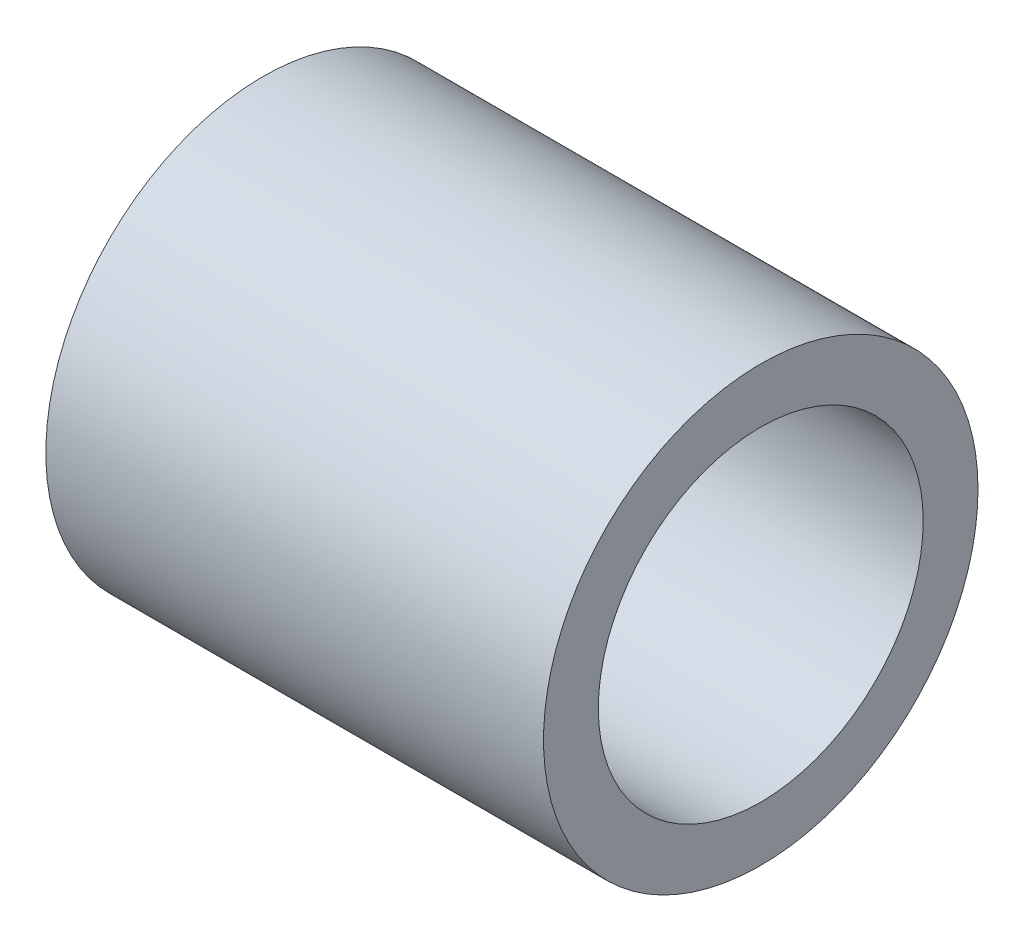
ISO-10303-21;
HEADER;
FILE_DESCRIPTION(('STEP AP214'),'2;1');
FILE_NAME('part.step','',(''),(''),'','','');
FILE_SCHEMA(('AUTOMOTIVE_DESIGN { 1 0 10303 214 1 1 1 1 }'));
ENDSEC;
DATA;
#1=APPLICATION_CONTEXT('core data for automotive mechanical design processes');
#2=APPLICATION_PROTOCOL_DEFINITION('international standard','automotive_design',2000,#1);
#3=PRODUCT_CONTEXT('',#1,'mechanical');
#4=PRODUCT('Part','Part','',(#3));
#5=PRODUCT_RELATED_PRODUCT_CATEGORY('part','',(#4));
#6=PRODUCT_DEFINITION_FORMATION('','',#4);
#7=PRODUCT_DEFINITION_CONTEXT('part definition',#1,'design');
#8=PRODUCT_DEFINITION('design','',#6,#7);
#9=PRODUCT_DEFINITION_SHAPE('','',#8);
#10=(LENGTH_UNIT() NAMED_UNIT(*) SI_UNIT(.MILLI.,.METRE.));
#11=(NAMED_UNIT(*) PLANE_ANGLE_UNIT() SI_UNIT($,.RADIAN.));
#12=(NAMED_UNIT(*) SI_UNIT($,.STERADIAN.) SOLID_ANGLE_UNIT());
#13=UNCERTAINTY_MEASURE_WITH_UNIT(LENGTH_MEASURE(1.E-05),#10,'distance_accuracy_value','');
#14=(GEOMETRIC_REPRESENTATION_CONTEXT(3) GLOBAL_UNCERTAINTY_ASSIGNED_CONTEXT((#13)) GLOBAL_UNIT_ASSIGNED_CONTEXT((#10,
#11,#12)) REPRESENTATION_CONTEXT('',''));
#15=CARTESIAN_POINT('',(0.,0.,0.));
#16=DIRECTION('',(0.,0.,1.));
#17=DIRECTION('',(1.,0.,0.));
#18=AXIS2_PLACEMENT_3D('',#15,#16,#17);
#19=CARTESIAN_POINT('',(-761.879738048823,1.03968051029432E-12,2.43645104092138E-12));
#20=DIRECTION('',(1.,0.,0.));
#21=DIRECTION('',(0.,0.,-1.));
#22=AXIS2_PLACEMENT_3D('',#19,#20,#21);
#23=CYLINDRICAL_SURFACE('',#22,50.7999999999999);
#24=CARTESIAN_POINT('',(-606.244603536271,7.97774916607265E-13,1.67617631790492E-12));
#25=DIRECTION('',(1.,0.,0.));
#26=DIRECTION('',(0.,0.,-1.));
#27=AXIS2_PLACEMENT_3D('',#24,#25,#26);
#28=CIRCLE('',#27,50.7999999999999);
#29=CARTESIAN_POINT('',(-606.244603536271,7.97774916607265E-13,-50.7999999999982));
#30=VERTEX_POINT('',#29);
#31=EDGE_CURVE('E26',#30,#30,#28,.F.);
#32=ORIENTED_EDGE('',*,*,#31,.F.);
#33=EDGE_LOOP('',(#32));
#34=FACE_BOUND('',#33,.T.);
#35=CARTESIAN_POINT('',(-761.879738048823,1.03968051029432E-12,2.43645104092138E-12));
#36=DIRECTION('',(1.,0.,0.));
#37=DIRECTION('',(0.,0.,-1.));
#38=AXIS2_PLACEMENT_3D('',#35,#36,#37);
#39=CIRCLE('',#38,50.7999999999999);
#40=CARTESIAN_POINT('',(-761.879738048823,1.03968051029432E-12,-50.7999999999974));
#41=VERTEX_POINT('',#40);
#42=EDGE_CURVE('E17',#41,#41,#39,.F.);
#43=ORIENTED_EDGE('',*,*,#42,.T.);
#44=EDGE_LOOP('',(#43));
#45=FACE_BOUND('',#44,.T.);
#46=ADVANCED_FACE('F14',(#34,#45),#23,.F.);
#47=CARTESIAN_POINT('',(-761.879738048823,1.03968051029432E-12,2.43645104092138E-12));
#48=DIRECTION('',(1.,0.,0.));
#49=DIRECTION('',(0.,0.,-1.));
#50=AXIS2_PLACEMENT_3D('',#47,#48,#49);
#51=PLANE('',#50);
#52=CARTESIAN_POINT('',(-761.879738048823,1.03968051029432E-12,2.43645104092138E-12));
#53=DIRECTION('',(1.,0.,0.));
#54=DIRECTION('',(0.,0.,-1.));
#55=AXIS2_PLACEMENT_3D('',#52,#53,#54);
#56=CIRCLE('',#55,67.9327869590422);
#57=CARTESIAN_POINT('',(-761.879738048823,1.03968051029432E-12,-67.9327869590397));
#58=VERTEX_POINT('',#57);
#59=EDGE_CURVE('E21',#58,#58,#56,.T.);
#60=ORIENTED_EDGE('',*,*,#59,.F.);
#61=EDGE_LOOP('',(#60));
#62=FACE_BOUND('',#61,.T.);
#63=ORIENTED_EDGE('',*,*,#42,.F.);
#64=EDGE_LOOP('',(#63));
#65=FACE_BOUND('',#64,.T.);
#66=ADVANCED_FACE('F35',(#62,#65),#51,.F.);
#67=CARTESIAN_POINT('',(-606.244603536271,1.03968051029432E-12,2.34621211347985E-12));
#68=DIRECTION('',(1.,0.,0.));
#69=DIRECTION('',(0.,0.,-1.));
#70=AXIS2_PLACEMENT_3D('',#67,#68,#69);
#71=PLANE('',#70);
#72=CARTESIAN_POINT('',(-606.244603536271,1.03968051029432E-12,2.35296827371641E-12));
#73=DIRECTION('',(1.,0.,0.));
#74=DIRECTION('',(0.,0.,-1.));
#75=AXIS2_PLACEMENT_3D('',#72,#73,#74);
#76=CIRCLE('',#75,67.9327869590422);
#77=CARTESIAN_POINT('',(-606.244603536271,1.03968051029432E-12,-67.9327869590398));
#78=VERTEX_POINT('',#77);
#79=EDGE_CURVE('E9',#78,#78,#76,.F.);
#80=ORIENTED_EDGE('',*,*,#79,.F.);
#81=EDGE_LOOP('',(#80));
#82=FACE_BOUND('',#81,.T.);
#83=ORIENTED_EDGE('',*,*,#31,.T.);
#84=EDGE_LOOP('',(#83));
#85=FACE_BOUND('',#84,.T.);
#86=ADVANCED_FACE('F37',(#82,#85),#71,.T.);
#87=CARTESIAN_POINT('',(-761.879738048823,1.03968051029432E-12,2.43645104092138E-12));
#88=DIRECTION('',(1.,0.,0.));
#89=DIRECTION('',(0.,0.,-1.));
#90=AXIS2_PLACEMENT_3D('',#87,#88,#89);
#91=CYLINDRICAL_SURFACE('',#90,67.9327869590422);
#92=ORIENTED_EDGE('',*,*,#59,.T.);
#93=EDGE_LOOP('',(#92));
#94=FACE_BOUND('',#93,.T.);
#95=ORIENTED_EDGE('',*,*,#79,.T.);
#96=EDGE_LOOP('',(#95));
#97=FACE_BOUND('',#96,.T.);
#98=ADVANCED_FACE('F44',(#94,#97),#91,.T.);
#99=CLOSED_SHELL('',(#46,#66,#86,#98));
#100=MANIFOLD_SOLID_BREP('B1',#99);
#101=ADVANCED_BREP_SHAPE_REPRESENTATION('',(#18,#100),#14);
#102=SHAPE_DEFINITION_REPRESENTATION(#9,#101);
ENDSEC;
END-ISO-10303-21;
